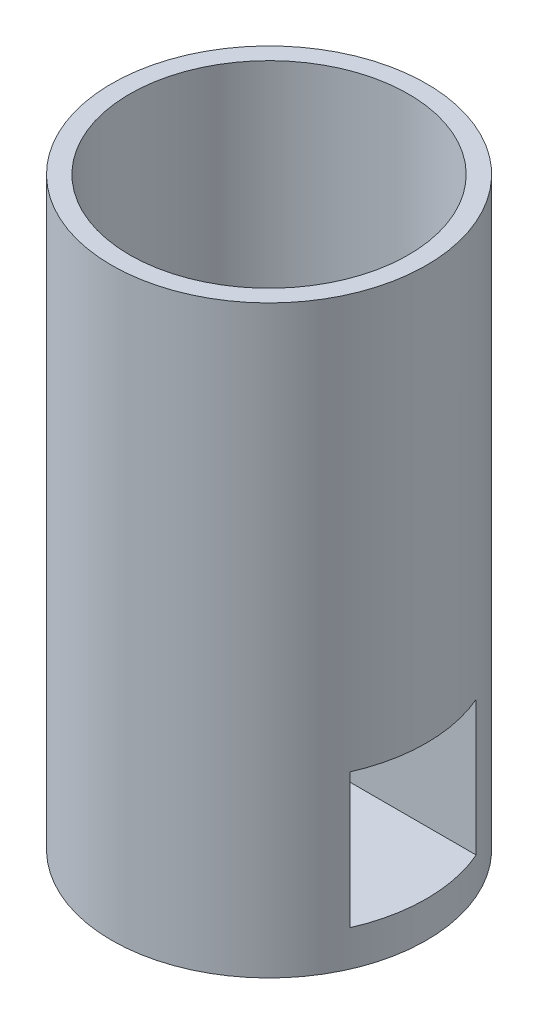
ISO-10303-21;
HEADER;
FILE_DESCRIPTION(('STEP AP214'),'2;1');
FILE_NAME('part.step','',(''),(''),'','','');
FILE_SCHEMA(('AUTOMOTIVE_DESIGN { 1 0 10303 214 1 1 1 1 }'));
ENDSEC;
DATA;
#1=APPLICATION_CONTEXT('core data for automotive mechanical design processes');
#2=APPLICATION_PROTOCOL_DEFINITION('international standard','automotive_design',2000,#1);
#3=PRODUCT_CONTEXT('',#1,'mechanical');
#4=PRODUCT('Part','Part','',(#3));
#5=PRODUCT_RELATED_PRODUCT_CATEGORY('part','',(#4));
#6=PRODUCT_DEFINITION_FORMATION('','',#4);
#7=PRODUCT_DEFINITION_CONTEXT('part definition',#1,'design');
#8=PRODUCT_DEFINITION('design','',#6,#7);
#9=PRODUCT_DEFINITION_SHAPE('','',#8);
#10=(LENGTH_UNIT() NAMED_UNIT(*) SI_UNIT(.MILLI.,.METRE.));
#11=(NAMED_UNIT(*) PLANE_ANGLE_UNIT() SI_UNIT($,.RADIAN.));
#12=(NAMED_UNIT(*) SI_UNIT($,.STERADIAN.) SOLID_ANGLE_UNIT());
#13=UNCERTAINTY_MEASURE_WITH_UNIT(LENGTH_MEASURE(1.E-05),#10,'distance_accuracy_value','');
#14=(GEOMETRIC_REPRESENTATION_CONTEXT(3) GLOBAL_UNCERTAINTY_ASSIGNED_CONTEXT((#13)) GLOBAL_UNIT_ASSIGNED_CONTEXT((#10,
#11,#12)) REPRESENTATION_CONTEXT('',''));
#15=CARTESIAN_POINT('',(0.,0.,0.));
#16=DIRECTION('',(0.,0.,1.));
#17=DIRECTION('',(1.,0.,0.));
#18=AXIS2_PLACEMENT_3D('',#15,#16,#17);
#19=CARTESIAN_POINT('',(3.87252377282188,65.,1.95311628250039));
#20=DIRECTION('',(0.,-1.,0.));
#21=DIRECTION('',(0.,0.,-1.));
#22=AXIS2_PLACEMENT_3D('',#19,#20,#21);
#23=CYLINDRICAL_SURFACE('',#22,17.5);
#24=DIRECTION('',(0.,-1.,0.));
#25=VECTOR('',#24,1.);
#26=CARTESIAN_POINT('',(-12.1750358320601,65.,-5.02727272727273));
#27=LINE('',#26,#25);
#28=CARTESIAN_POINT('',(-12.1750358320601,19.,-5.02727272727273));
#29=VERTEX_POINT('',#28);
#30=CARTESIAN_POINT('',(-12.1750358320601,4.,-5.02727272727273));
#31=VERTEX_POINT('',#30);
#32=EDGE_CURVE('E86',#29,#31,#27,.T.);
#33=ORIENTED_EDGE('',*,*,#32,.F.);
#34=CARTESIAN_POINT('',(3.87252377282188,19.,1.95311628250039));
#35=DIRECTION('',(0.,-1.,0.));
#36=DIRECTION('',(0.,0.,-1.));
#37=AXIS2_PLACEMENT_3D('',#34,#35,#36);
#38=CIRCLE('',#37,17.5);
#39=CARTESIAN_POINT('',(-12.1579179411761,19.,8.97272727272727));
#40=VERTEX_POINT('',#39);
#41=EDGE_CURVE('E88',#40,#29,#38,.T.);
#42=ORIENTED_EDGE('',*,*,#41,.F.);
#43=DIRECTION('',(0.,-1.,0.));
#44=VECTOR('',#43,1.);
#45=CARTESIAN_POINT('',(-12.1579179411761,65.,8.97272727272726));
#46=LINE('',#45,#44);
#47=CARTESIAN_POINT('',(-12.1579179411761,4.,8.97272727272728));
#48=VERTEX_POINT('',#47);
#49=EDGE_CURVE('E94',#48,#40,#46,.F.);
#50=ORIENTED_EDGE('',*,*,#49,.F.);
#51=CARTESIAN_POINT('',(3.87252377282188,4.,1.95311628250039));
#52=DIRECTION('',(0.,1.,0.));
#53=DIRECTION('',(0.,0.,1.));
#54=AXIS2_PLACEMENT_3D('',#51,#52,#53);
#55=CIRCLE('',#54,17.5);
#56=EDGE_CURVE('E101',#31,#48,#55,.T.);
#57=ORIENTED_EDGE('',*,*,#56,.F.);
#58=EDGE_LOOP('',(#33,#42,#50,#57));
#59=FACE_BOUND('',#58,.T.);
#60=CARTESIAN_POINT('',(3.87252377282188,65.,1.95311628250039));
#61=DIRECTION('',(0.,1.,0.));
#62=DIRECTION('',(0.,0.,1.));
#63=AXIS2_PLACEMENT_3D('',#60,#61,#62);
#64=CIRCLE('',#63,17.5);
#65=CARTESIAN_POINT('',(3.87252377282188,65.,19.4531162825004));
#66=VERTEX_POINT('',#65);
#67=EDGE_CURVE('E127',#66,#66,#64,.T.);
#68=ORIENTED_EDGE('',*,*,#67,.F.);
#69=EDGE_LOOP('',(#68));
#70=FACE_BOUND('',#69,.T.);
#71=CARTESIAN_POINT('',(3.87252377282188,0.,1.95311628250039));
#72=DIRECTION('',(0.,1.,0.));
#73=DIRECTION('',(0.,0.,1.));
#74=AXIS2_PLACEMENT_3D('',#71,#72,#73);
#75=CIRCLE('',#74,17.5);
#76=CARTESIAN_POINT('',(3.87252377282188,0.,19.4531162825004));
#77=VERTEX_POINT('',#76);
#78=EDGE_CURVE('E126',#77,#77,#75,.T.);
#79=ORIENTED_EDGE('',*,*,#78,.T.);
#80=EDGE_LOOP('',(#79));
#81=FACE_BOUND('',#80,.T.);
#82=DIRECTION('',(0.,-1.,0.));
#83=VECTOR('',#82,1.);
#84=CARTESIAN_POINT('',(19.9200833777038,65.,-5.02727272727273));
#85=LINE('',#84,#83);
#86=CARTESIAN_POINT('',(19.9200833777038,4.,-5.02727272727273));
#87=VERTEX_POINT('',#86);
#88=CARTESIAN_POINT('',(19.9200833777038,19.,-5.02727272727273));
#89=VERTEX_POINT('',#88);
#90=EDGE_CURVE('E11',#87,#89,#85,.F.);
#91=ORIENTED_EDGE('',*,*,#90,.F.);
#92=CARTESIAN_POINT('',(19.9029654868199,4.,8.97272727272728));
#93=VERTEX_POINT('',#92);
#94=EDGE_CURVE('E50',#93,#87,#55,.T.);
#95=ORIENTED_EDGE('',*,*,#94,.F.);
#96=DIRECTION('',(0.,-1.,0.));
#97=VECTOR('',#96,1.);
#98=CARTESIAN_POINT('',(19.9029654868198,65.,8.97272727272726));
#99=LINE('',#98,#97);
#100=CARTESIAN_POINT('',(19.9029654868198,19.,8.97272727272727));
#101=VERTEX_POINT('',#100);
#102=EDGE_CURVE('E85',#101,#93,#99,.T.);
#103=ORIENTED_EDGE('',*,*,#102,.F.);
#104=EDGE_CURVE('E80',#89,#101,#38,.T.);
#105=ORIENTED_EDGE('',*,*,#104,.F.);
#106=EDGE_LOOP('',(#91,#95,#103,#105));
#107=FACE_BOUND('',#106,.T.);
#108=ADVANCED_FACE('F41',(#59,#70,#81,#107),#23,.T.);
#109=CARTESIAN_POINT('',(3.87252377282188,65.,1.95311628250039));
#110=DIRECTION('',(0.,1.,0.));
#111=DIRECTION('',(0.,0.,1.));
#112=AXIS2_PLACEMENT_3D('',#109,#110,#111);
#113=PLANE('',#112);
#114=CARTESIAN_POINT('',(3.87252377282188,65.,1.95311628250039));
#115=DIRECTION('',(0.,1.,0.));
#116=DIRECTION('',(0.,0.,1.));
#117=AXIS2_PLACEMENT_3D('',#114,#115,#116);
#118=CIRCLE('',#117,15.5);
#119=CARTESIAN_POINT('',(3.87252377282188,65.,17.4531162825004));
#120=VERTEX_POINT('',#119);
#121=EDGE_CURVE('E118',#120,#120,#118,.T.);
#122=ORIENTED_EDGE('',*,*,#121,.F.);
#123=EDGE_LOOP('',(#122));
#124=FACE_BOUND('',#123,.T.);
#125=ORIENTED_EDGE('',*,*,#67,.T.);
#126=EDGE_LOOP('',(#125));
#127=FACE_BOUND('',#126,.T.);
#128=ADVANCED_FACE('F142',(#124,#127),#113,.T.);
#129=CARTESIAN_POINT('',(0.,0.,0.));
#130=DIRECTION('',(0.,1.,0.));
#131=DIRECTION('',(0.,0.,1.));
#132=AXIS2_PLACEMENT_3D('',#129,#130,#131);
#133=PLANE('',#132);
#134=CARTESIAN_POINT('',(9.7818181818182,0.,1.97272727272727));
#135=DIRECTION('',(0.,-1.,0.));
#136=DIRECTION('',(0.,0.,-1.));
#137=AXIS2_PLACEMENT_3D('',#134,#135,#136);
#138=CIRCLE('',#137,1.);
#139=CARTESIAN_POINT('',(9.7818181818182,0.,0.972727272727272));
#140=VERTEX_POINT('',#139);
#141=EDGE_CURVE('E105',#140,#140,#138,.T.);
#142=ORIENTED_EDGE('',*,*,#141,.F.);
#143=EDGE_LOOP('',(#142));
#144=FACE_BOUND('',#143,.T.);
#145=CARTESIAN_POINT('',(-0.218181818181805,0.,1.97272727272727));
#146=DIRECTION('',(0.,-1.,0.));
#147=DIRECTION('',(0.,0.,-1.));
#148=AXIS2_PLACEMENT_3D('',#145,#146,#147);
#149=CIRCLE('',#148,1.);
#150=CARTESIAN_POINT('',(-0.218181818181805,0.,0.972727272727272));
#151=VERTEX_POINT('',#150);
#152=EDGE_CURVE('E110',#151,#151,#149,.T.);
#153=ORIENTED_EDGE('',*,*,#152,.F.);
#154=EDGE_LOOP('',(#153));
#155=FACE_BOUND('',#154,.T.);
#156=ORIENTED_EDGE('',*,*,#78,.F.);
#157=EDGE_LOOP('',(#156));
#158=FACE_BOUND('',#157,.T.);
#159=ADVANCED_FACE('F43',(#144,#155,#158),#133,.F.);
#160=CARTESIAN_POINT('',(-74.2181818181818,19.,-5.02727272727273));
#161=DIRECTION('',(0.,0.,1.));
#162=DIRECTION('',(0.,-1.,0.));
#163=AXIS2_PLACEMENT_3D('',#160,#161,#162);
#164=PLANE('',#163);
#165=ORIENTED_EDGE('',*,*,#32,.T.);
#166=DIRECTION('',(1.,0.,0.));
#167=VECTOR('',#166,1.);
#168=CARTESIAN_POINT('',(-74.2181818181818,4.,-5.02727272727273));
#169=LINE('',#168,#167);
#170=EDGE_CURVE('E123',#31,#87,#169,.T.);
#171=ORIENTED_EDGE('',*,*,#170,.T.);
#172=ORIENTED_EDGE('',*,*,#90,.T.);
#173=DIRECTION('',(1.,0.,0.));
#174=VECTOR('',#173,1.);
#175=CARTESIAN_POINT('',(-74.2181818181818,19.,-5.02727272727273));
#176=LINE('',#175,#174);
#177=EDGE_CURVE('E58',#29,#89,#176,.T.);
#178=ORIENTED_EDGE('',*,*,#177,.F.);
#179=EDGE_LOOP('',(#165,#171,#172,#178));
#180=FACE_BOUND('',#179,.T.);
#181=ADVANCED_FACE('F137',(#180),#164,.T.);
#182=CARTESIAN_POINT('',(-74.2181818181818,4.,-5.02727272727273));
#183=DIRECTION('',(0.,1.,0.));
#184=DIRECTION('',(0.,0.,1.));
#185=AXIS2_PLACEMENT_3D('',#182,#183,#184);
#186=PLANE('',#185);
#187=CARTESIAN_POINT('',(9.7818181818182,4.,1.97272727272727));
#188=DIRECTION('',(0.,1.,0.));
#189=DIRECTION('',(0.,0.,1.));
#190=AXIS2_PLACEMENT_3D('',#187,#188,#189);
#191=CIRCLE('',#190,1.);
#192=CARTESIAN_POINT('',(9.7818181818182,4.,2.97272727272727));
#193=VERTEX_POINT('',#192);
#194=EDGE_CURVE('E45',#193,#193,#191,.T.);
#195=ORIENTED_EDGE('',*,*,#194,.F.);
#196=EDGE_LOOP('',(#195));
#197=FACE_BOUND('',#196,.T.);
#198=CARTESIAN_POINT('',(-0.218181818181805,4.,1.97272727272727));
#199=DIRECTION('',(0.,1.,0.));
#200=DIRECTION('',(0.,0.,1.));
#201=AXIS2_PLACEMENT_3D('',#198,#199,#200);
#202=CIRCLE('',#201,1.);
#203=CARTESIAN_POINT('',(-0.218181818181805,4.,2.97272727272727));
#204=VERTEX_POINT('',#203);
#205=EDGE_CURVE('E103',#204,#204,#202,.T.);
#206=ORIENTED_EDGE('',*,*,#205,.F.);
#207=EDGE_LOOP('',(#206));
#208=FACE_BOUND('',#207,.T.);
#209=ORIENTED_EDGE('',*,*,#94,.T.);
#210=ORIENTED_EDGE('',*,*,#170,.F.);
#211=ORIENTED_EDGE('',*,*,#56,.T.);
#212=DIRECTION('',(1.,0.,0.));
#213=VECTOR('',#212,1.);
#214=CARTESIAN_POINT('',(-74.2181818181818,4.,8.97272727272728));
#215=LINE('',#214,#213);
#216=EDGE_CURVE('E96',#48,#93,#215,.T.);
#217=ORIENTED_EDGE('',*,*,#216,.T.);
#218=EDGE_LOOP('',(#209,#210,#211,#217));
#219=FACE_BOUND('',#218,.T.);
#220=ADVANCED_FACE('F139',(#197,#208,#219),#186,.T.);
#221=CARTESIAN_POINT('',(-74.2181818181818,19.,8.97272727272727));
#222=DIRECTION('',(0.,0.,-1.));
#223=DIRECTION('',(0.,1.,0.));
#224=AXIS2_PLACEMENT_3D('',#221,#222,#223);
#225=PLANE('',#224);
#226=ORIENTED_EDGE('',*,*,#102,.T.);
#227=ORIENTED_EDGE('',*,*,#216,.F.);
#228=ORIENTED_EDGE('',*,*,#49,.T.);
#229=DIRECTION('',(1.,0.,0.));
#230=VECTOR('',#229,1.);
#231=CARTESIAN_POINT('',(-74.2181818181818,19.,8.97272727272727));
#232=LINE('',#231,#230);
#233=EDGE_CURVE('E62',#40,#101,#232,.T.);
#234=ORIENTED_EDGE('',*,*,#233,.T.);
#235=EDGE_LOOP('',(#226,#227,#228,#234));
#236=FACE_BOUND('',#235,.T.);
#237=ADVANCED_FACE('F90',(#236),#225,.T.);
#238=CARTESIAN_POINT('',(-74.2181818181818,19.,-5.02727272727273));
#239=DIRECTION('',(0.,-1.,0.));
#240=DIRECTION('',(0.,0.,-1.));
#241=AXIS2_PLACEMENT_3D('',#238,#239,#240);
#242=PLANE('',#241);
#243=ORIENTED_EDGE('',*,*,#104,.T.);
#244=ORIENTED_EDGE('',*,*,#233,.F.);
#245=ORIENTED_EDGE('',*,*,#41,.T.);
#246=ORIENTED_EDGE('',*,*,#177,.T.);
#247=EDGE_LOOP('',(#243,#244,#245,#246));
#248=FACE_BOUND('',#247,.T.);
#249=ADVANCED_FACE('F81',(#248),#242,.T.);
#250=CARTESIAN_POINT('',(-0.218181818181805,10.,1.97272727272727));
#251=DIRECTION('',(0.,-1.,0.));
#252=DIRECTION('',(0.,0.,-1.));
#253=AXIS2_PLACEMENT_3D('',#250,#251,#252);
#254=CYLINDRICAL_SURFACE('',#253,1.);
#255=ORIENTED_EDGE('',*,*,#205,.T.);
#256=EDGE_LOOP('',(#255));
#257=FACE_BOUND('',#256,.T.);
#258=ORIENTED_EDGE('',*,*,#152,.T.);
#259=EDGE_LOOP('',(#258));
#260=FACE_BOUND('',#259,.T.);
#261=ADVANCED_FACE('F161',(#257,#260),#254,.F.);
#262=CARTESIAN_POINT('',(9.7818181818182,10.,1.97272727272727));
#263=DIRECTION('',(0.,-1.,0.));
#264=DIRECTION('',(0.,0.,-1.));
#265=AXIS2_PLACEMENT_3D('',#262,#263,#264);
#266=CYLINDRICAL_SURFACE('',#265,1.);
#267=ORIENTED_EDGE('',*,*,#194,.T.);
#268=EDGE_LOOP('',(#267));
#269=FACE_BOUND('',#268,.T.);
#270=ORIENTED_EDGE('',*,*,#141,.T.);
#271=EDGE_LOOP('',(#270));
#272=FACE_BOUND('',#271,.T.);
#273=ADVANCED_FACE('F163',(#269,#272),#266,.F.);
#274=CARTESIAN_POINT('',(3.87252377282188,35.,1.95311628250039));
#275=DIRECTION('',(0.,1.,0.));
#276=DIRECTION('',(0.,0.,1.));
#277=AXIS2_PLACEMENT_3D('',#274,#275,#276);
#278=CYLINDRICAL_SURFACE('',#277,15.5);
#279=CARTESIAN_POINT('',(3.87252377282188,35.,1.95311628250039));
#280=DIRECTION('',(0.,1.,0.));
#281=DIRECTION('',(0.,0.,1.));
#282=AXIS2_PLACEMENT_3D('',#279,#280,#281);
#283=CIRCLE('',#282,15.5);
#284=CARTESIAN_POINT('',(3.87252377282188,35.,17.4531162825004));
#285=VERTEX_POINT('',#284);
#286=EDGE_CURVE('E115',#285,#285,#283,.T.);
#287=ORIENTED_EDGE('',*,*,#286,.F.);
#288=EDGE_LOOP('',(#287));
#289=FACE_BOUND('',#288,.T.);
#290=ORIENTED_EDGE('',*,*,#121,.T.);
#291=EDGE_LOOP('',(#290));
#292=FACE_BOUND('',#291,.T.);
#293=ADVANCED_FACE('F168',(#289,#292),#278,.F.);
#294=CARTESIAN_POINT('',(3.87252377282188,35.,1.95311628250039));
#295=DIRECTION('',(0.,1.,0.));
#296=DIRECTION('',(0.,0.,1.));
#297=AXIS2_PLACEMENT_3D('',#294,#295,#296);
#298=PLANE('',#297);
#299=ORIENTED_EDGE('',*,*,#286,.T.);
#300=EDGE_LOOP('',(#299));
#301=FACE_BOUND('',#300,.T.);
#302=ADVANCED_FACE('F218',(#301),#298,.T.);
#303=CLOSED_SHELL('',(#108,#128,#159,#181,#220,#237,#249,#261,#273,#293,#302));
#304=MANIFOLD_SOLID_BREP('B2',#303);
#305=ADVANCED_BREP_SHAPE_REPRESENTATION('',(#18,#304),#14);
#306=SHAPE_DEFINITION_REPRESENTATION(#9,#305);
ENDSEC;
END-ISO-10303-21;
